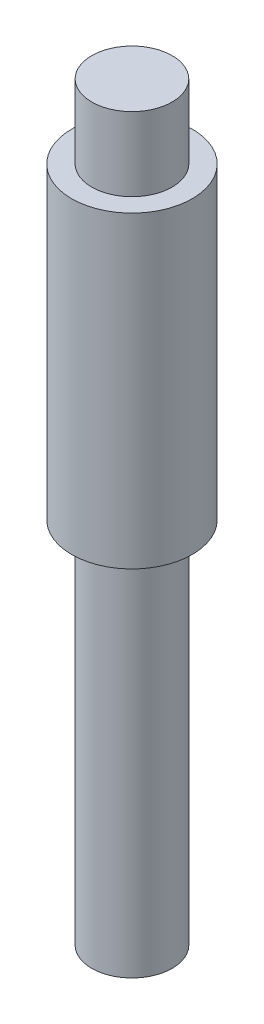
ISO-10303-21;
HEADER;
FILE_DESCRIPTION(('STEP AP214'),'2;1');
FILE_NAME('part.step','',(''),(''),'','','');
FILE_SCHEMA(('AUTOMOTIVE_DESIGN { 1 0 10303 214 1 1 1 1 }'));
ENDSEC;
DATA;
#1=APPLICATION_CONTEXT('core data for automotive mechanical design processes');
#2=APPLICATION_PROTOCOL_DEFINITION('international standard','automotive_design',2000,#1);
#3=PRODUCT_CONTEXT('',#1,'mechanical');
#4=PRODUCT('Part','Part','',(#3));
#5=PRODUCT_RELATED_PRODUCT_CATEGORY('part','',(#4));
#6=PRODUCT_DEFINITION_FORMATION('','',#4);
#7=PRODUCT_DEFINITION_CONTEXT('part definition',#1,'design');
#8=PRODUCT_DEFINITION('design','',#6,#7);
#9=PRODUCT_DEFINITION_SHAPE('','',#8);
#10=(LENGTH_UNIT() NAMED_UNIT(*) SI_UNIT(.MILLI.,.METRE.));
#11=(NAMED_UNIT(*) PLANE_ANGLE_UNIT() SI_UNIT($,.RADIAN.));
#12=(NAMED_UNIT(*) SI_UNIT($,.STERADIAN.) SOLID_ANGLE_UNIT());
#13=UNCERTAINTY_MEASURE_WITH_UNIT(LENGTH_MEASURE(1.E-05),#10,'distance_accuracy_value','');
#14=(GEOMETRIC_REPRESENTATION_CONTEXT(3) GLOBAL_UNCERTAINTY_ASSIGNED_CONTEXT((#13)) GLOBAL_UNIT_ASSIGNED_CONTEXT((#10,
#11,#12)) REPRESENTATION_CONTEXT('',''));
#15=CARTESIAN_POINT('',(0.,0.,0.));
#16=DIRECTION('',(0.,0.,1.));
#17=DIRECTION('',(1.,0.,0.));
#18=AXIS2_PLACEMENT_3D('',#15,#16,#17);
#19=CARTESIAN_POINT('',(0.,-13.75,0.));
#20=DIRECTION('',(0.,1.,0.));
#21=DIRECTION('',(0.,0.,1.));
#22=AXIS2_PLACEMENT_3D('',#19,#20,#21);
#23=CYLINDRICAL_SURFACE('',#22,1.5);
#24=CARTESIAN_POINT('',(0.,-13.75,0.));
#25=DIRECTION('',(0.,1.,0.));
#26=DIRECTION('',(0.,0.,1.));
#27=AXIS2_PLACEMENT_3D('',#24,#25,#26);
#28=CIRCLE('',#27,1.5);
#29=CARTESIAN_POINT('',(0.,-13.75,1.5));
#30=VERTEX_POINT('',#29);
#31=EDGE_CURVE('E41',#30,#30,#28,.T.);
#32=ORIENTED_EDGE('',*,*,#31,.T.);
#33=EDGE_LOOP('',(#32));
#34=FACE_BOUND('',#33,.T.);
#35=CARTESIAN_POINT('',(0.,0.,0.));
#36=DIRECTION('',(0.,1.,0.));
#37=DIRECTION('',(0.,0.,1.));
#38=AXIS2_PLACEMENT_3D('',#35,#36,#37);
#39=CIRCLE('',#38,1.5);
#40=CARTESIAN_POINT('',(0.,0.,1.5));
#41=VERTEX_POINT('',#40);
#42=EDGE_CURVE('E37',#41,#41,#39,.T.);
#43=ORIENTED_EDGE('',*,*,#42,.F.);
#44=EDGE_LOOP('',(#43));
#45=FACE_BOUND('',#44,.T.);
#46=ADVANCED_FACE('F34',(#34,#45),#23,.T.);
#47=CARTESIAN_POINT('',(0.,-13.75,0.));
#48=DIRECTION('',(0.,1.,0.));
#49=DIRECTION('',(0.,0.,1.));
#50=AXIS2_PLACEMENT_3D('',#47,#48,#49);
#51=PLANE('',#50);
#52=ORIENTED_EDGE('',*,*,#31,.F.);
#53=EDGE_LOOP('',(#52));
#54=FACE_BOUND('',#53,.T.);
#55=ADVANCED_FACE('F75',(#54),#51,.F.);
#56=CARTESIAN_POINT('',(0.,11.5,0.));
#57=DIRECTION('',(0.,-1.,0.));
#58=DIRECTION('',(0.,0.,-1.));
#59=AXIS2_PLACEMENT_3D('',#56,#57,#58);
#60=CYLINDRICAL_SURFACE('',#59,2.25);
#61=CARTESIAN_POINT('',(0.,11.5,0.));
#62=DIRECTION('',(0.,1.,0.));
#63=DIRECTION('',(0.,0.,1.));
#64=AXIS2_PLACEMENT_3D('',#61,#62,#63);
#65=CIRCLE('',#64,2.25);
#66=CARTESIAN_POINT('',(0.,11.5,2.25));
#67=VERTEX_POINT('',#66);
#68=EDGE_CURVE('E49',#67,#67,#65,.T.);
#69=ORIENTED_EDGE('',*,*,#68,.F.);
#70=EDGE_LOOP('',(#69));
#71=FACE_BOUND('',#70,.T.);
#72=CARTESIAN_POINT('',(0.,0.,0.));
#73=DIRECTION('',(0.,1.,0.));
#74=DIRECTION('',(0.,0.,1.));
#75=AXIS2_PLACEMENT_3D('',#72,#73,#74);
#76=CIRCLE('',#75,2.25);
#77=CARTESIAN_POINT('',(0.,0.,2.25));
#78=VERTEX_POINT('',#77);
#79=EDGE_CURVE('E52',#78,#78,#76,.T.);
#80=ORIENTED_EDGE('',*,*,#79,.T.);
#81=EDGE_LOOP('',(#80));
#82=FACE_BOUND('',#81,.T.);
#83=ADVANCED_FACE('F80',(#71,#82),#60,.T.);
#84=CARTESIAN_POINT('',(0.,11.5,0.));
#85=DIRECTION('',(0.,1.,0.));
#86=DIRECTION('',(0.,0.,1.));
#87=AXIS2_PLACEMENT_3D('',#84,#85,#86);
#88=PLANE('',#87);
#89=CARTESIAN_POINT('',(0.,11.5,0.));
#90=DIRECTION('',(0.,1.,0.));
#91=DIRECTION('',(0.,0.,1.));
#92=AXIS2_PLACEMENT_3D('',#89,#90,#91);
#93=CIRCLE('',#92,1.5);
#94=CARTESIAN_POINT('',(0.,11.5,1.5));
#95=VERTEX_POINT('',#94);
#96=EDGE_CURVE('E10',#95,#95,#93,.T.);
#97=ORIENTED_EDGE('',*,*,#96,.F.);
#98=EDGE_LOOP('',(#97));
#99=FACE_BOUND('',#98,.T.);
#100=ORIENTED_EDGE('',*,*,#68,.T.);
#101=EDGE_LOOP('',(#100));
#102=FACE_BOUND('',#101,.T.);
#103=ADVANCED_FACE('F70',(#99,#102),#88,.T.);
#104=CARTESIAN_POINT('',(0.,0.,0.));
#105=DIRECTION('',(0.,1.,0.));
#106=DIRECTION('',(0.,0.,1.));
#107=AXIS2_PLACEMENT_3D('',#104,#105,#106);
#108=PLANE('',#107);
#109=ORIENTED_EDGE('',*,*,#42,.T.);
#110=EDGE_LOOP('',(#109));
#111=FACE_BOUND('',#110,.T.);
#112=ORIENTED_EDGE('',*,*,#79,.F.);
#113=EDGE_LOOP('',(#112));
#114=FACE_BOUND('',#113,.T.);
#115=ADVANCED_FACE('F63',(#111,#114),#108,.F.);
#116=CARTESIAN_POINT('',(0.,14.25,0.));
#117=DIRECTION('',(0.,-1.,0.));
#118=DIRECTION('',(0.,0.,-1.));
#119=AXIS2_PLACEMENT_3D('',#116,#117,#118);
#120=CYLINDRICAL_SURFACE('',#119,1.5);
#121=CARTESIAN_POINT('',(0.,14.25,0.));
#122=DIRECTION('',(0.,1.,0.));
#123=DIRECTION('',(0.,0.,1.));
#124=AXIS2_PLACEMENT_3D('',#121,#122,#123);
#125=CIRCLE('',#124,1.5);
#126=CARTESIAN_POINT('',(0.,14.25,1.5));
#127=VERTEX_POINT('',#126);
#128=EDGE_CURVE('E48',#127,#127,#125,.T.);
#129=ORIENTED_EDGE('',*,*,#128,.F.);
#130=EDGE_LOOP('',(#129));
#131=FACE_BOUND('',#130,.T.);
#132=ORIENTED_EDGE('',*,*,#96,.T.);
#133=EDGE_LOOP('',(#132));
#134=FACE_BOUND('',#133,.T.);
#135=ADVANCED_FACE('F61',(#131,#134),#120,.T.);
#136=CARTESIAN_POINT('',(0.,14.25,0.));
#137=DIRECTION('',(0.,1.,0.));
#138=DIRECTION('',(0.,0.,1.));
#139=AXIS2_PLACEMENT_3D('',#136,#137,#138);
#140=PLANE('',#139);
#141=ORIENTED_EDGE('',*,*,#128,.T.);
#142=EDGE_LOOP('',(#141));
#143=FACE_BOUND('',#142,.T.);
#144=ADVANCED_FACE('F59',(#143),#140,.T.);
#145=CLOSED_SHELL('',(#46,#55,#83,#103,#115,#135,#144));
#146=MANIFOLD_SOLID_BREP('B2',#145);
#147=ADVANCED_BREP_SHAPE_REPRESENTATION('',(#18,#146),#14);
#148=SHAPE_DEFINITION_REPRESENTATION(#9,#147);
ENDSEC;
END-ISO-10303-21;
